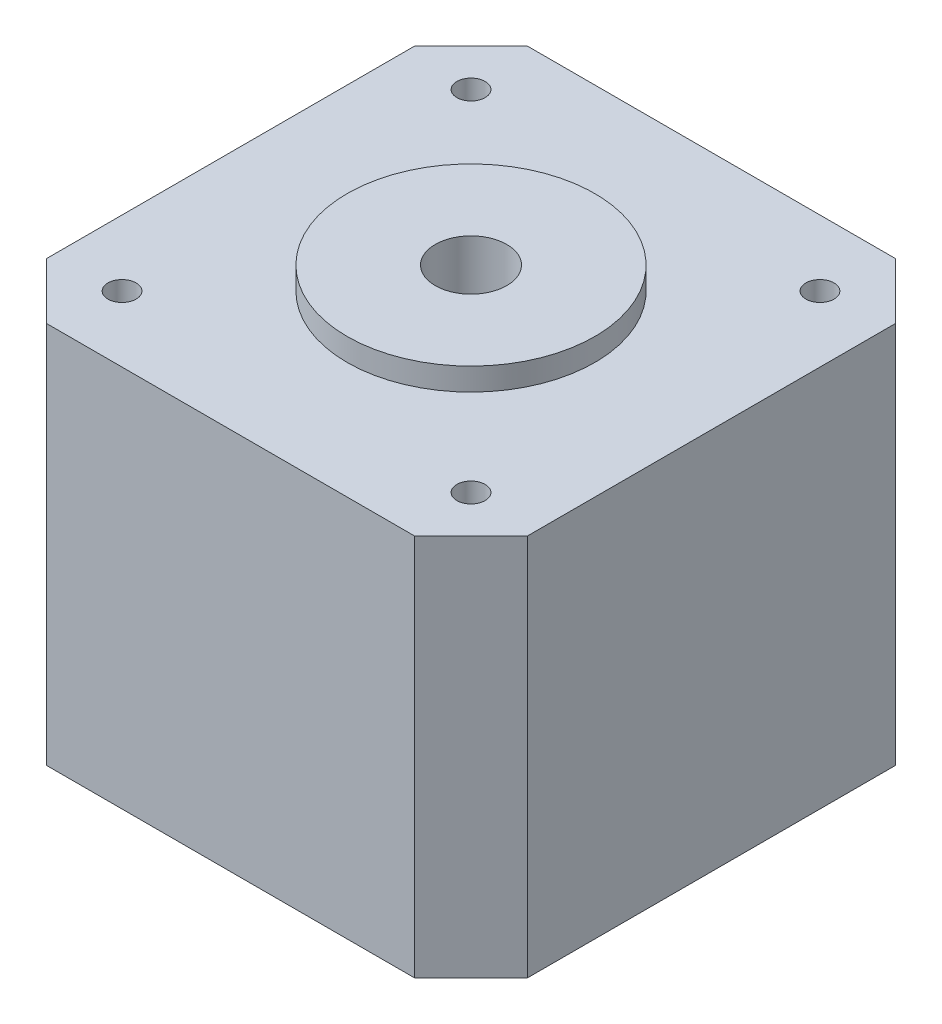
ISO-10303-21;
HEADER;
FILE_DESCRIPTION(('STEP AP214'),'2;1');
FILE_NAME('part.step','',(''),(''),'','','');
FILE_SCHEMA(('AUTOMOTIVE_DESIGN { 1 0 10303 214 1 1 1 1 }'));
ENDSEC;
DATA;
#1=APPLICATION_CONTEXT('core data for automotive mechanical design processes');
#2=APPLICATION_PROTOCOL_DEFINITION('international standard','automotive_design',2000,#1);
#3=PRODUCT_CONTEXT('',#1,'mechanical');
#4=PRODUCT('Part','Part','',(#3));
#5=PRODUCT_RELATED_PRODUCT_CATEGORY('part','',(#4));
#6=PRODUCT_DEFINITION_FORMATION('','',#4);
#7=PRODUCT_DEFINITION_CONTEXT('part definition',#1,'design');
#8=PRODUCT_DEFINITION('design','',#6,#7);
#9=PRODUCT_DEFINITION_SHAPE('','',#8);
#10=(LENGTH_UNIT() NAMED_UNIT(*) SI_UNIT(.MILLI.,.METRE.));
#11=(NAMED_UNIT(*) PLANE_ANGLE_UNIT() SI_UNIT($,.RADIAN.));
#12=(NAMED_UNIT(*) SI_UNIT($,.STERADIAN.) SOLID_ANGLE_UNIT());
#13=UNCERTAINTY_MEASURE_WITH_UNIT(LENGTH_MEASURE(1.E-05),#10,'distance_accuracy_value','');
#14=(GEOMETRIC_REPRESENTATION_CONTEXT(3) GLOBAL_UNCERTAINTY_ASSIGNED_CONTEXT((#13)) GLOBAL_UNIT_ASSIGNED_CONTEXT((#10,
#11,#12)) REPRESENTATION_CONTEXT('',''));
#15=CARTESIAN_POINT('',(0.,0.,0.));
#16=DIRECTION('',(0.,0.,1.));
#17=DIRECTION('',(1.,0.,0.));
#18=AXIS2_PLACEMENT_3D('',#15,#16,#17);
#19=CARTESIAN_POINT('',(21.35,34.,21.35));
#20=DIRECTION('',(-1.,0.,0.));
#21=DIRECTION('',(0.,0.,1.));
#22=AXIS2_PLACEMENT_3D('',#19,#20,#21);
#23=PLANE('',#22);
#24=DIRECTION('',(0.,0.,-1.));
#25=VECTOR('',#24,1.);
#26=CARTESIAN_POINT('',(21.35,34.,21.35));
#27=LINE('',#26,#25);
#28=CARTESIAN_POINT('',(21.35,34.,16.35));
#29=VERTEX_POINT('',#28);
#30=CARTESIAN_POINT('',(21.35,34.,-16.35));
#31=VERTEX_POINT('',#30);
#32=EDGE_CURVE('E162',#29,#31,#27,.T.);
#33=ORIENTED_EDGE('',*,*,#32,.F.);
#34=DIRECTION('',(0.,-1.,0.));
#35=VECTOR('',#34,1.);
#36=CARTESIAN_POINT('',(21.35,34.,16.35));
#37=LINE('',#36,#35);
#38=CARTESIAN_POINT('',(21.35,0.,16.35));
#39=VERTEX_POINT('',#38);
#40=EDGE_CURVE('E207',#29,#39,#37,.T.);
#41=ORIENTED_EDGE('',*,*,#40,.T.);
#42=DIRECTION('',(0.,0.,-1.));
#43=VECTOR('',#42,1.);
#44=CARTESIAN_POINT('',(21.35,0.,21.35));
#45=LINE('',#44,#43);
#46=CARTESIAN_POINT('',(21.35,0.,-16.35));
#47=VERTEX_POINT('',#46);
#48=EDGE_CURVE('E156',#39,#47,#45,.T.);
#49=ORIENTED_EDGE('',*,*,#48,.T.);
#50=DIRECTION('',(0.,1.,0.));
#51=VECTOR('',#50,1.);
#52=CARTESIAN_POINT('',(21.35,34.,-16.35));
#53=LINE('',#52,#51);
#54=EDGE_CURVE('E205',#47,#31,#53,.T.);
#55=ORIENTED_EDGE('',*,*,#54,.T.);
#56=EDGE_LOOP('',(#33,#41,#49,#55));
#57=FACE_BOUND('',#56,.T.);
#58=ADVANCED_FACE('F38',(#57),#23,.F.);
#59=CARTESIAN_POINT('',(-21.35,34.,-21.35));
#60=DIRECTION('',(0.,0.,1.));
#61=DIRECTION('',(1.,0.,0.));
#62=AXIS2_PLACEMENT_3D('',#59,#60,#61);
#63=PLANE('',#62);
#64=DIRECTION('',(-1.,0.,0.));
#65=VECTOR('',#64,1.);
#66=CARTESIAN_POINT('',(-21.35,34.,-21.35));
#67=LINE('',#66,#65);
#68=CARTESIAN_POINT('',(16.35,34.,-21.35));
#69=VERTEX_POINT('',#68);
#70=CARTESIAN_POINT('',(-16.35,34.,-21.35));
#71=VERTEX_POINT('',#70);
#72=EDGE_CURVE('E164',#69,#71,#67,.T.);
#73=ORIENTED_EDGE('',*,*,#72,.F.);
#74=DIRECTION('',(0.,-1.,0.));
#75=VECTOR('',#74,1.);
#76=CARTESIAN_POINT('',(16.35,34.,-21.35));
#77=LINE('',#76,#75);
#78=CARTESIAN_POINT('',(16.35,0.,-21.35));
#79=VERTEX_POINT('',#78);
#80=EDGE_CURVE('E11',#69,#79,#77,.T.);
#81=ORIENTED_EDGE('',*,*,#80,.T.);
#82=DIRECTION('',(-1.,0.,0.));
#83=VECTOR('',#82,1.);
#84=CARTESIAN_POINT('',(-21.35,0.,-21.35));
#85=LINE('',#84,#83);
#86=CARTESIAN_POINT('',(-16.35,0.,-21.35));
#87=VERTEX_POINT('',#86);
#88=EDGE_CURVE('E174',#79,#87,#85,.T.);
#89=ORIENTED_EDGE('',*,*,#88,.T.);
#90=DIRECTION('',(0.,1.,0.));
#91=VECTOR('',#90,1.);
#92=CARTESIAN_POINT('',(-16.35,34.,-21.35));
#93=LINE('',#92,#91);
#94=EDGE_CURVE('E46',#87,#71,#93,.T.);
#95=ORIENTED_EDGE('',*,*,#94,.T.);
#96=EDGE_LOOP('',(#73,#81,#89,#95));
#97=FACE_BOUND('',#96,.T.);
#98=ADVANCED_FACE('F223',(#97),#63,.F.);
#99=CARTESIAN_POINT('',(-21.35,34.,21.35));
#100=DIRECTION('',(1.,0.,0.));
#101=DIRECTION('',(0.,0.,-1.));
#102=AXIS2_PLACEMENT_3D('',#99,#100,#101);
#103=PLANE('',#102);
#104=DIRECTION('',(0.,0.,1.));
#105=VECTOR('',#104,1.);
#106=CARTESIAN_POINT('',(-21.35,0.,21.35));
#107=LINE('',#106,#105);
#108=CARTESIAN_POINT('',(-21.35,0.,-16.35));
#109=VERTEX_POINT('',#108);
#110=CARTESIAN_POINT('',(-21.35,0.,16.35));
#111=VERTEX_POINT('',#110);
#112=EDGE_CURVE('E176',#109,#111,#107,.T.);
#113=ORIENTED_EDGE('',*,*,#112,.T.);
#114=DIRECTION('',(0.,1.,0.));
#115=VECTOR('',#114,1.);
#116=CARTESIAN_POINT('',(-21.35,34.,16.35));
#117=LINE('',#116,#115);
#118=CARTESIAN_POINT('',(-21.35,34.,16.35));
#119=VERTEX_POINT('',#118);
#120=EDGE_CURVE('E196',#111,#119,#117,.T.);
#121=ORIENTED_EDGE('',*,*,#120,.T.);
#122=DIRECTION('',(0.,0.,1.));
#123=VECTOR('',#122,1.);
#124=CARTESIAN_POINT('',(-21.35,34.,21.35));
#125=LINE('',#124,#123);
#126=CARTESIAN_POINT('',(-21.35,34.,-16.35));
#127=VERTEX_POINT('',#126);
#128=EDGE_CURVE('E167',#127,#119,#125,.T.);
#129=ORIENTED_EDGE('',*,*,#128,.F.);
#130=DIRECTION('',(0.,-1.,0.));
#131=VECTOR('',#130,1.);
#132=CARTESIAN_POINT('',(-21.35,34.,-16.35));
#133=LINE('',#132,#131);
#134=EDGE_CURVE('E193',#127,#109,#133,.T.);
#135=ORIENTED_EDGE('',*,*,#134,.T.);
#136=EDGE_LOOP('',(#113,#121,#129,#135));
#137=FACE_BOUND('',#136,.T.);
#138=ADVANCED_FACE('F231',(#137),#103,.F.);
#139=CARTESIAN_POINT('',(-21.35,34.,21.35));
#140=DIRECTION('',(0.,0.,-1.));
#141=DIRECTION('',(-1.,0.,0.));
#142=AXIS2_PLACEMENT_3D('',#139,#140,#141);
#143=PLANE('',#142);
#144=DIRECTION('',(1.,0.,0.));
#145=VECTOR('',#144,1.);
#146=CARTESIAN_POINT('',(-21.35,34.,21.35));
#147=LINE('',#146,#145);
#148=CARTESIAN_POINT('',(-16.35,34.,21.35));
#149=VERTEX_POINT('',#148);
#150=CARTESIAN_POINT('',(16.35,34.,21.35));
#151=VERTEX_POINT('',#150);
#152=EDGE_CURVE('E161',#149,#151,#147,.T.);
#153=ORIENTED_EDGE('',*,*,#152,.F.);
#154=DIRECTION('',(0.,-1.,0.));
#155=VECTOR('',#154,1.);
#156=CARTESIAN_POINT('',(-16.35,34.,21.35));
#157=LINE('',#156,#155);
#158=CARTESIAN_POINT('',(-16.35,0.,21.35));
#159=VERTEX_POINT('',#158);
#160=EDGE_CURVE('E182',#149,#159,#157,.T.);
#161=ORIENTED_EDGE('',*,*,#160,.T.);
#162=DIRECTION('',(1.,0.,0.));
#163=VECTOR('',#162,1.);
#164=CARTESIAN_POINT('',(-21.35,0.,21.35));
#165=LINE('',#164,#163);
#166=CARTESIAN_POINT('',(16.35,0.,21.35));
#167=VERTEX_POINT('',#166);
#168=EDGE_CURVE('E165',#159,#167,#165,.T.);
#169=ORIENTED_EDGE('',*,*,#168,.T.);
#170=DIRECTION('',(0.,1.,0.));
#171=VECTOR('',#170,1.);
#172=CARTESIAN_POINT('',(16.35,34.,21.35));
#173=LINE('',#172,#171);
#174=EDGE_CURVE('E160',#167,#151,#173,.T.);
#175=ORIENTED_EDGE('',*,*,#174,.T.);
#176=EDGE_LOOP('',(#153,#161,#169,#175));
#177=FACE_BOUND('',#176,.T.);
#178=ADVANCED_FACE('F239',(#177),#143,.F.);
#179=CARTESIAN_POINT('',(0.,34.,0.));
#180=DIRECTION('',(0.,-1.,0.));
#181=DIRECTION('',(0.,0.,-1.));
#182=AXIS2_PLACEMENT_3D('',#179,#180,#181);
#183=PLANE('',#182);
#184=CARTESIAN_POINT('',(15.5,34.,-15.5));
#185=DIRECTION('',(0.,1.,0.));
#186=DIRECTION('',(0.,0.,1.));
#187=AXIS2_PLACEMENT_3D('',#184,#185,#186);
#188=CIRCLE('',#187,1.24999999999999);
#189=CARTESIAN_POINT('',(15.5,34.,-14.25));
#190=VERTEX_POINT('',#189);
#191=EDGE_CURVE('E125',#190,#190,#188,.T.);
#192=ORIENTED_EDGE('',*,*,#191,.F.);
#193=EDGE_LOOP('',(#192));
#194=FACE_BOUND('',#193,.T.);
#195=CARTESIAN_POINT('',(-15.5,34.,15.5));
#196=DIRECTION('',(0.,1.,0.));
#197=DIRECTION('',(0.,0.,1.));
#198=AXIS2_PLACEMENT_3D('',#195,#196,#197);
#199=CIRCLE('',#198,1.24999999999999);
#200=CARTESIAN_POINT('',(-15.5,34.,16.75));
#201=VERTEX_POINT('',#200);
#202=EDGE_CURVE('E124',#201,#201,#199,.T.);
#203=ORIENTED_EDGE('',*,*,#202,.F.);
#204=EDGE_LOOP('',(#203));
#205=FACE_BOUND('',#204,.T.);
#206=CARTESIAN_POINT('',(-15.5,34.,-15.5));
#207=DIRECTION('',(0.,1.,0.));
#208=DIRECTION('',(0.,0.,1.));
#209=AXIS2_PLACEMENT_3D('',#206,#207,#208);
#210=CIRCLE('',#209,1.24999999999999);
#211=CARTESIAN_POINT('',(-15.5,34.,-14.25));
#212=VERTEX_POINT('',#211);
#213=EDGE_CURVE('E135',#212,#212,#210,.T.);
#214=ORIENTED_EDGE('',*,*,#213,.F.);
#215=EDGE_LOOP('',(#214));
#216=FACE_BOUND('',#215,.T.);
#217=CARTESIAN_POINT('',(15.5,34.,15.5));
#218=DIRECTION('',(0.,1.,0.));
#219=DIRECTION('',(0.,0.,1.));
#220=AXIS2_PLACEMENT_3D('',#217,#218,#219);
#221=CIRCLE('',#220,1.24999999999999);
#222=CARTESIAN_POINT('',(15.5,34.,16.75));
#223=VERTEX_POINT('',#222);
#224=EDGE_CURVE('E141',#223,#223,#221,.T.);
#225=ORIENTED_EDGE('',*,*,#224,.F.);
#226=EDGE_LOOP('',(#225));
#227=FACE_BOUND('',#226,.T.);
#228=CARTESIAN_POINT('',(0.,34.,0.));
#229=DIRECTION('',(0.,1.,0.));
#230=DIRECTION('',(0.,0.,1.));
#231=AXIS2_PLACEMENT_3D('',#228,#229,#230);
#232=CIRCLE('',#231,11.);
#233=CARTESIAN_POINT('',(0.,34.,11.));
#234=VERTEX_POINT('',#233);
#235=EDGE_CURVE('E157',#234,#234,#232,.T.);
#236=ORIENTED_EDGE('',*,*,#235,.F.);
#237=EDGE_LOOP('',(#236));
#238=FACE_BOUND('',#237,.T.);
#239=ORIENTED_EDGE('',*,*,#128,.T.);
#240=DIRECTION('',(-0.707106781186546,0.,-0.707106781186549));
#241=VECTOR('',#240,1.);
#242=CARTESIAN_POINT('',(-16.35,34.,21.35));
#243=LINE('',#242,#241);
#244=EDGE_CURVE('E203',#119,#149,#243,.F.);
#245=ORIENTED_EDGE('',*,*,#244,.T.);
#246=ORIENTED_EDGE('',*,*,#152,.T.);
#247=DIRECTION('',(-0.707106781186549,0.,0.707106781186546));
#248=VECTOR('',#247,1.);
#249=CARTESIAN_POINT('',(21.35,34.,16.35));
#250=LINE('',#249,#248);
#251=EDGE_CURVE('E201',#151,#29,#250,.F.);
#252=ORIENTED_EDGE('',*,*,#251,.T.);
#253=ORIENTED_EDGE('',*,*,#32,.T.);
#254=DIRECTION('',(0.707106781186546,0.,0.707106781186549));
#255=VECTOR('',#254,1.);
#256=CARTESIAN_POINT('',(16.35,34.,-21.35));
#257=LINE('',#256,#255);
#258=EDGE_CURVE('E59',#31,#69,#257,.F.);
#259=ORIENTED_EDGE('',*,*,#258,.T.);
#260=ORIENTED_EDGE('',*,*,#72,.T.);
#261=DIRECTION('',(0.707106781186549,0.,-0.707106781186546));
#262=VECTOR('',#261,1.);
#263=CARTESIAN_POINT('',(-21.35,34.,-16.35));
#264=LINE('',#263,#262);
#265=EDGE_CURVE('E198',#71,#127,#264,.F.);
#266=ORIENTED_EDGE('',*,*,#265,.T.);
#267=EDGE_LOOP('',(#239,#245,#246,#252,#253,#259,#260,#266));
#268=FACE_BOUND('',#267,.T.);
#269=ADVANCED_FACE('F225',(#194,#205,#216,#227,#238,#268),#183,.F.);
#270=CARTESIAN_POINT('',(0.,0.,0.));
#271=DIRECTION('',(0.,-1.,0.));
#272=DIRECTION('',(0.,0.,-1.));
#273=AXIS2_PLACEMENT_3D('',#270,#271,#272);
#274=PLANE('',#273);
#275=CARTESIAN_POINT('',(0.,0.,0.));
#276=DIRECTION('',(0.,1.,0.));
#277=DIRECTION('',(0.,0.,1.));
#278=AXIS2_PLACEMENT_3D('',#275,#276,#277);
#279=CIRCLE('',#278,3.175);
#280=CARTESIAN_POINT('',(0.,0.,3.175));
#281=VERTEX_POINT('',#280);
#282=EDGE_CURVE('E148',#281,#281,#279,.T.);
#283=ORIENTED_EDGE('',*,*,#282,.T.);
#284=EDGE_LOOP('',(#283));
#285=FACE_BOUND('',#284,.T.);
#286=ORIENTED_EDGE('',*,*,#168,.F.);
#287=DIRECTION('',(0.707106781186546,0.,0.707106781186549));
#288=VECTOR('',#287,1.);
#289=CARTESIAN_POINT('',(-18.85,0.,18.8499999999999));
#290=LINE('',#289,#288);
#291=EDGE_CURVE('E191',#159,#111,#290,.F.);
#292=ORIENTED_EDGE('',*,*,#291,.T.);
#293=ORIENTED_EDGE('',*,*,#112,.F.);
#294=DIRECTION('',(-0.707106781186549,0.,0.707106781186546));
#295=VECTOR('',#294,1.);
#296=CARTESIAN_POINT('',(-18.85,0.,-18.85));
#297=LINE('',#296,#295);
#298=EDGE_CURVE('E185',#109,#87,#297,.F.);
#299=ORIENTED_EDGE('',*,*,#298,.T.);
#300=ORIENTED_EDGE('',*,*,#88,.F.);
#301=DIRECTION('',(-0.707106781186546,0.,-0.707106781186549));
#302=VECTOR('',#301,1.);
#303=CARTESIAN_POINT('',(18.85,0.,-18.85));
#304=LINE('',#303,#302);
#305=EDGE_CURVE('E187',#79,#47,#304,.F.);
#306=ORIENTED_EDGE('',*,*,#305,.T.);
#307=ORIENTED_EDGE('',*,*,#48,.F.);
#308=DIRECTION('',(0.707106781186549,0.,-0.707106781186546));
#309=VECTOR('',#308,1.);
#310=CARTESIAN_POINT('',(18.85,0.,18.85));
#311=LINE('',#310,#309);
#312=EDGE_CURVE('E189',#39,#167,#311,.F.);
#313=ORIENTED_EDGE('',*,*,#312,.T.);
#314=EDGE_LOOP('',(#286,#292,#293,#299,#300,#306,#307,#313));
#315=FACE_BOUND('',#314,.T.);
#316=ADVANCED_FACE('F218',(#285,#315),#274,.T.);
#317=CARTESIAN_POINT('',(0.,36.,0.));
#318=DIRECTION('',(0.,-1.,0.));
#319=DIRECTION('',(0.,0.,-1.));
#320=AXIS2_PLACEMENT_3D('',#317,#318,#319);
#321=CYLINDRICAL_SURFACE('',#320,11.);
#322=CARTESIAN_POINT('',(0.,36.,0.));
#323=DIRECTION('',(0.,1.,0.));
#324=DIRECTION('',(0.,0.,1.));
#325=AXIS2_PLACEMENT_3D('',#322,#323,#324);
#326=CIRCLE('',#325,11.);
#327=CARTESIAN_POINT('',(0.,36.,11.));
#328=VERTEX_POINT('',#327);
#329=EDGE_CURVE('E151',#328,#328,#326,.T.);
#330=ORIENTED_EDGE('',*,*,#329,.F.);
#331=EDGE_LOOP('',(#330));
#332=FACE_BOUND('',#331,.T.);
#333=ORIENTED_EDGE('',*,*,#235,.T.);
#334=EDGE_LOOP('',(#333));
#335=FACE_BOUND('',#334,.T.);
#336=ADVANCED_FACE('F263',(#332,#335),#321,.T.);
#337=CARTESIAN_POINT('',(0.,36.,0.));
#338=DIRECTION('',(0.,1.,0.));
#339=DIRECTION('',(0.,0.,1.));
#340=AXIS2_PLACEMENT_3D('',#337,#338,#339);
#341=PLANE('',#340);
#342=CARTESIAN_POINT('',(0.,36.,0.));
#343=DIRECTION('',(0.,1.,0.));
#344=DIRECTION('',(0.,0.,1.));
#345=AXIS2_PLACEMENT_3D('',#342,#343,#344);
#346=CIRCLE('',#345,3.175);
#347=CARTESIAN_POINT('',(0.,36.,3.175));
#348=VERTEX_POINT('',#347);
#349=EDGE_CURVE('E147',#348,#348,#346,.T.);
#350=ORIENTED_EDGE('',*,*,#349,.F.);
#351=EDGE_LOOP('',(#350));
#352=FACE_BOUND('',#351,.T.);
#353=ORIENTED_EDGE('',*,*,#329,.T.);
#354=EDGE_LOOP('',(#353));
#355=FACE_BOUND('',#354,.T.);
#356=ADVANCED_FACE('F270',(#352,#355),#341,.T.);
#357=CARTESIAN_POINT('',(0.,0.,0.));
#358=DIRECTION('',(0.,1.,0.));
#359=DIRECTION('',(0.,0.,1.));
#360=AXIS2_PLACEMENT_3D('',#357,#358,#359);
#361=CYLINDRICAL_SURFACE('',#360,3.175);
#362=ORIENTED_EDGE('',*,*,#282,.F.);
#363=EDGE_LOOP('',(#362));
#364=FACE_BOUND('',#363,.T.);
#365=ORIENTED_EDGE('',*,*,#349,.T.);
#366=EDGE_LOOP('',(#365));
#367=FACE_BOUND('',#366,.T.);
#368=ADVANCED_FACE('F274',(#364,#367),#361,.F.);
#369=CARTESIAN_POINT('',(15.5,26.5,15.5));
#370=DIRECTION('',(0.,1.,0.));
#371=DIRECTION('',(0.,0.,1.));
#372=AXIS2_PLACEMENT_3D('',#369,#370,#371);
#373=CONICAL_SURFACE('',#372,1.25,1.02974425867665);
#374=CARTESIAN_POINT('',(15.5,25.7489242262156,15.5));
#375=VERTEX_POINT('',#374);
#376=VERTEX_LOOP('',#375);
#377=FACE_BOUND('',#376,.T.);
#378=CARTESIAN_POINT('',(15.5,26.5,15.5));
#379=DIRECTION('',(0.,1.,0.));
#380=DIRECTION('',(0.,0.,1.));
#381=AXIS2_PLACEMENT_3D('',#378,#379,#380);
#382=CIRCLE('',#381,1.25);
#383=CARTESIAN_POINT('',(15.5,26.5,16.75));
#384=VERTEX_POINT('',#383);
#385=EDGE_CURVE('E144',#384,#384,#382,.T.);
#386=ORIENTED_EDGE('',*,*,#385,.T.);
#387=EDGE_LOOP('',(#386));
#388=FACE_BOUND('',#387,.T.);
#389=ADVANCED_FACE('F278',(#377,#388),#373,.F.);
#390=CARTESIAN_POINT('',(15.5,34.,15.5));
#391=DIRECTION('',(0.,1.,0.));
#392=DIRECTION('',(0.,0.,1.));
#393=AXIS2_PLACEMENT_3D('',#390,#391,#392);
#394=CYLINDRICAL_SURFACE('',#393,1.24999999999999);
#395=ORIENTED_EDGE('',*,*,#385,.F.);
#396=EDGE_LOOP('',(#395));
#397=FACE_BOUND('',#396,.T.);
#398=ORIENTED_EDGE('',*,*,#224,.T.);
#399=EDGE_LOOP('',(#398));
#400=FACE_BOUND('',#399,.T.);
#401=ADVANCED_FACE('F282',(#397,#400),#394,.F.);
#402=CARTESIAN_POINT('',(-15.5,26.5,-15.5));
#403=DIRECTION('',(0.,1.,0.));
#404=DIRECTION('',(0.,0.,1.));
#405=AXIS2_PLACEMENT_3D('',#402,#403,#404);
#406=CONICAL_SURFACE('',#405,1.25,1.02974425867665);
#407=CARTESIAN_POINT('',(-15.5,25.7489242262156,-15.5));
#408=VERTEX_POINT('',#407);
#409=VERTEX_LOOP('',#408);
#410=FACE_BOUND('',#409,.T.);
#411=CARTESIAN_POINT('',(-15.5,26.5,-15.5));
#412=DIRECTION('',(0.,1.,0.));
#413=DIRECTION('',(0.,0.,1.));
#414=AXIS2_PLACEMENT_3D('',#411,#412,#413);
#415=CIRCLE('',#414,1.25);
#416=CARTESIAN_POINT('',(-15.5,26.5,-14.25));
#417=VERTEX_POINT('',#416);
#418=EDGE_CURVE('E138',#417,#417,#415,.T.);
#419=ORIENTED_EDGE('',*,*,#418,.T.);
#420=EDGE_LOOP('',(#419));
#421=FACE_BOUND('',#420,.T.);
#422=ADVANCED_FACE('F286',(#410,#421),#406,.F.);
#423=CARTESIAN_POINT('',(-15.5,34.,-15.5));
#424=DIRECTION('',(0.,1.,0.));
#425=DIRECTION('',(0.,0.,1.));
#426=AXIS2_PLACEMENT_3D('',#423,#424,#425);
#427=CYLINDRICAL_SURFACE('',#426,1.24999999999999);
#428=ORIENTED_EDGE('',*,*,#418,.F.);
#429=EDGE_LOOP('',(#428));
#430=FACE_BOUND('',#429,.T.);
#431=ORIENTED_EDGE('',*,*,#213,.T.);
#432=EDGE_LOOP('',(#431));
#433=FACE_BOUND('',#432,.T.);
#434=ADVANCED_FACE('F290',(#430,#433),#427,.F.);
#435=CARTESIAN_POINT('',(-15.5,26.5,15.5));
#436=DIRECTION('',(0.,1.,0.));
#437=DIRECTION('',(0.,0.,1.));
#438=AXIS2_PLACEMENT_3D('',#435,#436,#437);
#439=CONICAL_SURFACE('',#438,1.25,1.02974425867665);
#440=CARTESIAN_POINT('',(-15.5,25.7489242262156,15.5));
#441=VERTEX_POINT('',#440);
#442=VERTEX_LOOP('',#441);
#443=FACE_BOUND('',#442,.T.);
#444=CARTESIAN_POINT('',(-15.5,26.5,15.5));
#445=DIRECTION('',(0.,1.,0.));
#446=DIRECTION('',(0.,0.,1.));
#447=AXIS2_PLACEMENT_3D('',#444,#445,#446);
#448=CIRCLE('',#447,1.25);
#449=CARTESIAN_POINT('',(-15.5,26.5,16.75));
#450=VERTEX_POINT('',#449);
#451=EDGE_CURVE('E128',#450,#450,#448,.T.);
#452=ORIENTED_EDGE('',*,*,#451,.T.);
#453=EDGE_LOOP('',(#452));
#454=FACE_BOUND('',#453,.T.);
#455=ADVANCED_FACE('F294',(#443,#454),#439,.F.);
#456=CARTESIAN_POINT('',(-15.5,34.,15.5));
#457=DIRECTION('',(0.,1.,0.));
#458=DIRECTION('',(0.,0.,1.));
#459=AXIS2_PLACEMENT_3D('',#456,#457,#458);
#460=CYLINDRICAL_SURFACE('',#459,1.24999999999999);
#461=ORIENTED_EDGE('',*,*,#451,.F.);
#462=EDGE_LOOP('',(#461));
#463=FACE_BOUND('',#462,.T.);
#464=ORIENTED_EDGE('',*,*,#202,.T.);
#465=EDGE_LOOP('',(#464));
#466=FACE_BOUND('',#465,.T.);
#467=ADVANCED_FACE('F118',(#463,#466),#460,.F.);
#468=CARTESIAN_POINT('',(15.5,26.5,-15.5));
#469=DIRECTION('',(0.,1.,0.));
#470=DIRECTION('',(0.,0.,1.));
#471=AXIS2_PLACEMENT_3D('',#468,#469,#470);
#472=CONICAL_SURFACE('',#471,1.25,1.02974425867665);
#473=CARTESIAN_POINT('',(15.5,25.7489242262156,-15.5));
#474=VERTEX_POINT('',#473);
#475=VERTEX_LOOP('',#474);
#476=FACE_BOUND('',#475,.T.);
#477=CARTESIAN_POINT('',(15.5,26.5,-15.5));
#478=DIRECTION('',(0.,1.,0.));
#479=DIRECTION('',(0.,0.,1.));
#480=AXIS2_PLACEMENT_3D('',#477,#478,#479);
#481=CIRCLE('',#480,1.25);
#482=CARTESIAN_POINT('',(15.5,26.5,-14.25));
#483=VERTEX_POINT('',#482);
#484=EDGE_CURVE('E122',#483,#483,#481,.T.);
#485=ORIENTED_EDGE('',*,*,#484,.T.);
#486=EDGE_LOOP('',(#485));
#487=FACE_BOUND('',#486,.T.);
#488=ADVANCED_FACE('F114',(#476,#487),#472,.F.);
#489=CARTESIAN_POINT('',(15.5,34.,-15.5));
#490=DIRECTION('',(0.,1.,0.));
#491=DIRECTION('',(0.,0.,1.));
#492=AXIS2_PLACEMENT_3D('',#489,#490,#491);
#493=CYLINDRICAL_SURFACE('',#492,1.24999999999999);
#494=ORIENTED_EDGE('',*,*,#484,.F.);
#495=EDGE_LOOP('',(#494));
#496=FACE_BOUND('',#495,.T.);
#497=ORIENTED_EDGE('',*,*,#191,.T.);
#498=EDGE_LOOP('',(#497));
#499=FACE_BOUND('',#498,.T.);
#500=ADVANCED_FACE('F117',(#496,#499),#493,.F.);
#501=CARTESIAN_POINT('',(-16.35,34.,21.35));
#502=DIRECTION('',(0.707106781186549,0.,-0.707106781186546));
#503=DIRECTION('',(0.,-1.,0.));
#504=AXIS2_PLACEMENT_3D('',#501,#502,#503);
#505=PLANE('',#504);
#506=ORIENTED_EDGE('',*,*,#244,.F.);
#507=ORIENTED_EDGE('',*,*,#120,.F.);
#508=ORIENTED_EDGE('',*,*,#291,.F.);
#509=ORIENTED_EDGE('',*,*,#160,.F.);
#510=EDGE_LOOP('',(#506,#507,#508,#509));
#511=FACE_BOUND('',#510,.T.);
#512=ADVANCED_FACE('F236',(#511),#505,.F.);
#513=CARTESIAN_POINT('',(21.35,34.,16.35));
#514=DIRECTION('',(-0.707106781186546,0.,-0.707106781186549));
#515=DIRECTION('',(0.,-1.,0.));
#516=AXIS2_PLACEMENT_3D('',#513,#514,#515);
#517=PLANE('',#516);
#518=ORIENTED_EDGE('',*,*,#251,.F.);
#519=ORIENTED_EDGE('',*,*,#174,.F.);
#520=ORIENTED_EDGE('',*,*,#312,.F.);
#521=ORIENTED_EDGE('',*,*,#40,.F.);
#522=EDGE_LOOP('',(#518,#519,#520,#521));
#523=FACE_BOUND('',#522,.T.);
#524=ADVANCED_FACE('F241',(#523),#517,.F.);
#525=CARTESIAN_POINT('',(16.35,34.,-21.35));
#526=DIRECTION('',(-0.707106781186549,0.,0.707106781186546));
#527=DIRECTION('',(0.,-1.,0.));
#528=AXIS2_PLACEMENT_3D('',#525,#526,#527);
#529=PLANE('',#528);
#530=ORIENTED_EDGE('',*,*,#258,.F.);
#531=ORIENTED_EDGE('',*,*,#54,.F.);
#532=ORIENTED_EDGE('',*,*,#305,.F.);
#533=ORIENTED_EDGE('',*,*,#80,.F.);
#534=EDGE_LOOP('',(#530,#531,#532,#533));
#535=FACE_BOUND('',#534,.T.);
#536=ADVANCED_FACE('F222',(#535),#529,.F.);
#537=CARTESIAN_POINT('',(-21.35,34.,-16.35));
#538=DIRECTION('',(0.707106781186546,0.,0.707106781186549));
#539=DIRECTION('',(0.,-1.,0.));
#540=AXIS2_PLACEMENT_3D('',#537,#538,#539);
#541=PLANE('',#540);
#542=ORIENTED_EDGE('',*,*,#265,.F.);
#543=ORIENTED_EDGE('',*,*,#94,.F.);
#544=ORIENTED_EDGE('',*,*,#298,.F.);
#545=ORIENTED_EDGE('',*,*,#134,.F.);
#546=EDGE_LOOP('',(#542,#543,#544,#545));
#547=FACE_BOUND('',#546,.T.);
#548=ADVANCED_FACE('F40',(#547),#541,.F.);
#549=CLOSED_SHELL('',(#58,#98,#138,#178,#269,#316,#336,#356,#368,#389,#401,#422,#434,#455,#467,
#488,#500,#512,#524,#536,#548));
#550=MANIFOLD_SOLID_BREP('B2',#549);
#551=ADVANCED_BREP_SHAPE_REPRESENTATION('',(#18,#550),#14);
#552=SHAPE_DEFINITION_REPRESENTATION(#9,#551);
ENDSEC;
END-ISO-10303-21;
